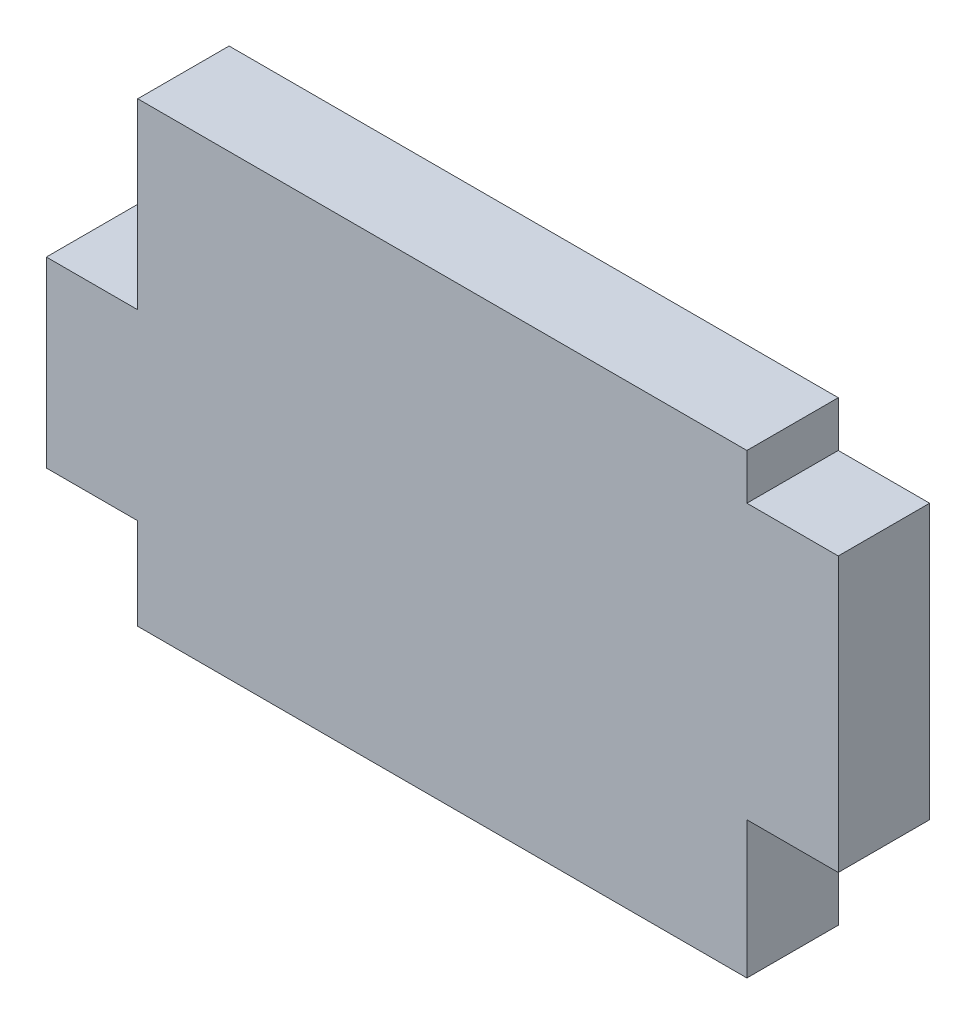
ISO-10303-21;
HEADER;
FILE_DESCRIPTION(('STEP AP214'),'2;1');
FILE_NAME('part.step','',(''),(''),'','','');
FILE_SCHEMA(('AUTOMOTIVE_DESIGN { 1 0 10303 214 1 1 1 1 }'));
ENDSEC;
DATA;
#1=APPLICATION_CONTEXT('core data for automotive mechanical design processes');
#2=APPLICATION_PROTOCOL_DEFINITION('international standard','automotive_design',2000,#1);
#3=PRODUCT_CONTEXT('',#1,'mechanical');
#4=PRODUCT('Part','Part','',(#3));
#5=PRODUCT_RELATED_PRODUCT_CATEGORY('part','',(#4));
#6=PRODUCT_DEFINITION_FORMATION('','',#4);
#7=PRODUCT_DEFINITION_CONTEXT('part definition',#1,'design');
#8=PRODUCT_DEFINITION('design','',#6,#7);
#9=PRODUCT_DEFINITION_SHAPE('','',#8);
#10=(LENGTH_UNIT() NAMED_UNIT(*) SI_UNIT(.MILLI.,.METRE.));
#11=(NAMED_UNIT(*) PLANE_ANGLE_UNIT() SI_UNIT($,.RADIAN.));
#12=(NAMED_UNIT(*) SI_UNIT($,.STERADIAN.) SOLID_ANGLE_UNIT());
#13=UNCERTAINTY_MEASURE_WITH_UNIT(LENGTH_MEASURE(1.E-05),#10,'distance_accuracy_value','');
#14=(GEOMETRIC_REPRESENTATION_CONTEXT(3) GLOBAL_UNCERTAINTY_ASSIGNED_CONTEXT((#13)) GLOBAL_UNIT_ASSIGNED_CONTEXT((#10,
#11,#12)) REPRESENTATION_CONTEXT('',''));
#15=CARTESIAN_POINT('',(0.,0.,0.));
#16=DIRECTION('',(0.,0.,1.));
#17=DIRECTION('',(1.,0.,0.));
#18=AXIS2_PLACEMENT_3D('',#15,#16,#17);
#19=CARTESIAN_POINT('',(0.,0.,6.));
#20=DIRECTION('',(1.,0.,0.));
#21=DIRECTION('',(0.,0.,-1.));
#22=AXIS2_PLACEMENT_3D('',#19,#20,#21);
#23=PLANE('',#22);
#24=DIRECTION('',(0.,-1.,0.));
#25=VECTOR('',#24,1.);
#26=CARTESIAN_POINT('',(0.,0.,6.));
#27=LINE('',#26,#25);
#28=CARTESIAN_POINT('',(0.,17.9999999999958,6.));
#29=VERTEX_POINT('',#28);
#30=CARTESIAN_POINT('',(0.,6.00000000000119,6.));
#31=VERTEX_POINT('',#30);
#32=EDGE_CURVE('E148',#29,#31,#27,.T.);
#33=ORIENTED_EDGE('',*,*,#32,.F.);
#34=DIRECTION('',(0.,0.,1.));
#35=VECTOR('',#34,1.);
#36=CARTESIAN_POINT('',(0.,17.9999999999958,0.));
#37=LINE('',#36,#35);
#38=CARTESIAN_POINT('',(0.,17.9999999999958,0.));
#39=VERTEX_POINT('',#38);
#40=EDGE_CURVE('E196',#39,#29,#37,.T.);
#41=ORIENTED_EDGE('',*,*,#40,.F.);
#42=DIRECTION('',(0.,-1.,0.));
#43=VECTOR('',#42,1.);
#44=CARTESIAN_POINT('',(0.,0.,0.));
#45=LINE('',#44,#43);
#46=CARTESIAN_POINT('',(0.,6.00000000000119,0.));
#47=VERTEX_POINT('',#46);
#48=EDGE_CURVE('E150',#39,#47,#45,.T.);
#49=ORIENTED_EDGE('',*,*,#48,.T.);
#50=DIRECTION('',(0.,0.,1.));
#51=VECTOR('',#50,1.);
#52=CARTESIAN_POINT('',(0.,6.00000000000119,0.));
#53=LINE('',#52,#51);
#54=EDGE_CURVE('E182',#47,#31,#53,.T.);
#55=ORIENTED_EDGE('',*,*,#54,.T.);
#56=EDGE_LOOP('',(#33,#41,#49,#55));
#57=FACE_BOUND('',#56,.T.);
#58=ADVANCED_FACE('F35',(#57),#23,.F.);
#59=CARTESIAN_POINT('',(0.,0.,6.));
#60=DIRECTION('',(0.,1.,0.));
#61=DIRECTION('',(0.,0.,1.));
#62=AXIS2_PLACEMENT_3D('',#59,#60,#61);
#63=PLANE('',#62);
#64=DIRECTION('',(1.,0.,0.));
#65=VECTOR('',#64,1.);
#66=CARTESIAN_POINT('',(0.,0.,0.));
#67=LINE('',#66,#65);
#68=CARTESIAN_POINT('',(6.00000000000119,0.,0.));
#69=VERTEX_POINT('',#68);
#70=CARTESIAN_POINT('',(46.000000000001,0.,0.));
#71=VERTEX_POINT('',#70);
#72=EDGE_CURVE('E146',#69,#71,#67,.T.);
#73=ORIENTED_EDGE('',*,*,#72,.T.);
#74=DIRECTION('',(0.,0.,1.));
#75=VECTOR('',#74,1.);
#76=CARTESIAN_POINT('',(46.000000000001,0.,0.));
#77=LINE('',#76,#75);
#78=CARTESIAN_POINT('',(46.000000000001,0.,6.));
#79=VERTEX_POINT('',#78);
#80=EDGE_CURVE('E174',#71,#79,#77,.T.);
#81=ORIENTED_EDGE('',*,*,#80,.T.);
#82=DIRECTION('',(1.,0.,0.));
#83=VECTOR('',#82,1.);
#84=CARTESIAN_POINT('',(0.,0.,6.));
#85=LINE('',#84,#83);
#86=CARTESIAN_POINT('',(6.00000000000119,0.,6.));
#87=VERTEX_POINT('',#86);
#88=EDGE_CURVE('E157',#87,#79,#85,.T.);
#89=ORIENTED_EDGE('',*,*,#88,.F.);
#90=DIRECTION('',(0.,0.,1.));
#91=VECTOR('',#90,1.);
#92=CARTESIAN_POINT('',(6.00000000000119,0.,0.));
#93=LINE('',#92,#91);
#94=EDGE_CURVE('E177',#69,#87,#93,.T.);
#95=ORIENTED_EDGE('',*,*,#94,.F.);
#96=EDGE_LOOP('',(#73,#81,#89,#95));
#97=FACE_BOUND('',#96,.T.);
#98=ADVANCED_FACE('F220',(#97),#63,.F.);
#99=CARTESIAN_POINT('',(52.,0.,6.));
#100=DIRECTION('',(-1.,0.,0.));
#101=DIRECTION('',(0.,0.,1.));
#102=AXIS2_PLACEMENT_3D('',#99,#100,#101);
#103=PLANE('',#102);
#104=DIRECTION('',(0.,1.,0.));
#105=VECTOR('',#104,1.);
#106=CARTESIAN_POINT('',(52.,0.,6.));
#107=LINE('',#106,#105);
#108=CARTESIAN_POINT('',(52.,8.99999999999925,6.));
#109=VERTEX_POINT('',#108);
#110=CARTESIAN_POINT('',(52.,26.9999999999992,6.));
#111=VERTEX_POINT('',#110);
#112=EDGE_CURVE('E43',#109,#111,#107,.T.);
#113=ORIENTED_EDGE('',*,*,#112,.F.);
#114=DIRECTION('',(0.,0.,1.));
#115=VECTOR('',#114,1.);
#116=CARTESIAN_POINT('',(52.,8.99999999999925,0.));
#117=LINE('',#116,#115);
#118=CARTESIAN_POINT('',(52.,8.99999999999925,0.));
#119=VERTEX_POINT('',#118);
#120=EDGE_CURVE('E128',#119,#109,#117,.T.);
#121=ORIENTED_EDGE('',*,*,#120,.F.);
#122=DIRECTION('',(0.,1.,0.));
#123=VECTOR('',#122,1.);
#124=CARTESIAN_POINT('',(52.,0.,0.));
#125=LINE('',#124,#123);
#126=CARTESIAN_POINT('',(52.,26.9999999999992,0.));
#127=VERTEX_POINT('',#126);
#128=EDGE_CURVE('E139',#119,#127,#125,.T.);
#129=ORIENTED_EDGE('',*,*,#128,.T.);
#130=DIRECTION('',(0.,0.,1.));
#131=VECTOR('',#130,1.);
#132=CARTESIAN_POINT('',(52.,26.9999999999992,0.));
#133=LINE('',#132,#131);
#134=EDGE_CURVE('E154',#127,#111,#133,.T.);
#135=ORIENTED_EDGE('',*,*,#134,.T.);
#136=EDGE_LOOP('',(#113,#121,#129,#135));
#137=FACE_BOUND('',#136,.T.);
#138=ADVANCED_FACE('F137',(#137),#103,.F.);
#139=CARTESIAN_POINT('',(0.,30.,6.));
#140=DIRECTION('',(0.,-1.,0.));
#141=DIRECTION('',(0.,0.,-1.));
#142=AXIS2_PLACEMENT_3D('',#139,#140,#141);
#143=PLANE('',#142);
#144=DIRECTION('',(-1.,0.,0.));
#145=VECTOR('',#144,1.);
#146=CARTESIAN_POINT('',(0.,30.,0.));
#147=LINE('',#146,#145);
#148=CARTESIAN_POINT('',(46.000000000001,30.,0.));
#149=VERTEX_POINT('',#148);
#150=CARTESIAN_POINT('',(6.00000000000111,30.,0.));
#151=VERTEX_POINT('',#150);
#152=EDGE_CURVE('E38',#149,#151,#147,.T.);
#153=ORIENTED_EDGE('',*,*,#152,.T.);
#154=DIRECTION('',(0.,0.,1.));
#155=VECTOR('',#154,1.);
#156=CARTESIAN_POINT('',(6.00000000000111,30.,0.));
#157=LINE('',#156,#155);
#158=CARTESIAN_POINT('',(6.00000000000111,30.,6.));
#159=VERTEX_POINT('',#158);
#160=EDGE_CURVE('E200',#151,#159,#157,.T.);
#161=ORIENTED_EDGE('',*,*,#160,.T.);
#162=DIRECTION('',(-1.,0.,0.));
#163=VECTOR('',#162,1.);
#164=CARTESIAN_POINT('',(0.,30.,6.));
#165=LINE('',#164,#163);
#166=CARTESIAN_POINT('',(46.000000000001,30.,6.));
#167=VERTEX_POINT('',#166);
#168=EDGE_CURVE('E11',#167,#159,#165,.T.);
#169=ORIENTED_EDGE('',*,*,#168,.F.);
#170=DIRECTION('',(0.,0.,1.));
#171=VECTOR('',#170,1.);
#172=CARTESIAN_POINT('',(46.000000000001,30.,0.));
#173=LINE('',#172,#171);
#174=EDGE_CURVE('E162',#149,#167,#173,.T.);
#175=ORIENTED_EDGE('',*,*,#174,.F.);
#176=EDGE_LOOP('',(#153,#161,#169,#175));
#177=FACE_BOUND('',#176,.T.);
#178=ADVANCED_FACE('F244',(#177),#143,.F.);
#179=CARTESIAN_POINT('',(0.,0.,6.));
#180=DIRECTION('',(0.,0.,-1.));
#181=DIRECTION('',(-1.,0.,0.));
#182=AXIS2_PLACEMENT_3D('',#179,#180,#181);
#183=PLANE('',#182);
#184=ORIENTED_EDGE('',*,*,#88,.T.);
#185=DIRECTION('',(0.,-1.,0.));
#186=VECTOR('',#185,1.);
#187=CARTESIAN_POINT('',(46.000000000001,0.,6.));
#188=LINE('',#187,#186);
#189=CARTESIAN_POINT('',(46.000000000001,8.99999999999925,6.));
#190=VERTEX_POINT('',#189);
#191=EDGE_CURVE('E133',#190,#79,#188,.T.);
#192=ORIENTED_EDGE('',*,*,#191,.F.);
#193=DIRECTION('',(-1.,0.,0.));
#194=VECTOR('',#193,1.);
#195=CARTESIAN_POINT('',(52.,8.99999999999925,6.));
#196=LINE('',#195,#194);
#197=EDGE_CURVE('E203',#109,#190,#196,.T.);
#198=ORIENTED_EDGE('',*,*,#197,.F.);
#199=ORIENTED_EDGE('',*,*,#112,.T.);
#200=DIRECTION('',(1.,0.,0.));
#201=VECTOR('',#200,1.);
#202=CARTESIAN_POINT('',(52.,26.9999999999992,6.));
#203=LINE('',#202,#201);
#204=CARTESIAN_POINT('',(46.000000000001,26.9999999999992,6.));
#205=VERTEX_POINT('',#204);
#206=EDGE_CURVE('E167',#205,#111,#203,.T.);
#207=ORIENTED_EDGE('',*,*,#206,.F.);
#208=DIRECTION('',(0.,-1.,0.));
#209=VECTOR('',#208,1.);
#210=CARTESIAN_POINT('',(46.000000000001,30.,6.));
#211=LINE('',#210,#209);
#212=EDGE_CURVE('E171',#167,#205,#211,.T.);
#213=ORIENTED_EDGE('',*,*,#212,.F.);
#214=ORIENTED_EDGE('',*,*,#168,.T.);
#215=DIRECTION('',(0.,1.,0.));
#216=VECTOR('',#215,1.);
#217=CARTESIAN_POINT('',(6.00000000000111,30.,6.));
#218=LINE('',#217,#216);
#219=CARTESIAN_POINT('',(6.00000000000111,17.9999999999958,6.));
#220=VERTEX_POINT('',#219);
#221=EDGE_CURVE('E204',#220,#159,#218,.T.);
#222=ORIENTED_EDGE('',*,*,#221,.F.);
#223=DIRECTION('',(1.,0.,0.));
#224=VECTOR('',#223,1.);
#225=CARTESIAN_POINT('',(0.,17.9999999999958,6.));
#226=LINE('',#225,#224);
#227=EDGE_CURVE('E185',#29,#220,#226,.T.);
#228=ORIENTED_EDGE('',*,*,#227,.F.);
#229=ORIENTED_EDGE('',*,*,#32,.T.);
#230=DIRECTION('',(-1.,8.96418356210837E-13,0.));
#231=VECTOR('',#230,1.);
#232=CARTESIAN_POINT('',(0.,6.00000000000119,6.));
#233=LINE('',#232,#231);
#234=CARTESIAN_POINT('',(6.00000000000119,5.99999999999581,6.));
#235=VERTEX_POINT('',#234);
#236=EDGE_CURVE('E186',#235,#31,#233,.T.);
#237=ORIENTED_EDGE('',*,*,#236,.F.);
#238=DIRECTION('',(0.,1.,0.));
#239=VECTOR('',#238,1.);
#240=CARTESIAN_POINT('',(6.00000000000119,0.,6.));
#241=LINE('',#240,#239);
#242=EDGE_CURVE('E189',#87,#235,#241,.T.);
#243=ORIENTED_EDGE('',*,*,#242,.F.);
#244=EDGE_LOOP('',(#184,#192,#198,#199,#207,#213,#214,#222,#228,#229,#237,#243));
#245=FACE_BOUND('',#244,.T.);
#246=ADVANCED_FACE('F228',(#245),#183,.F.);
#247=CARTESIAN_POINT('',(0.,0.,0.));
#248=DIRECTION('',(0.,0.,-1.));
#249=DIRECTION('',(-1.,0.,0.));
#250=AXIS2_PLACEMENT_3D('',#247,#248,#249);
#251=PLANE('',#250);
#252=DIRECTION('',(0.,-1.,0.));
#253=VECTOR('',#252,1.);
#254=CARTESIAN_POINT('',(46.000000000001,0.,0.));
#255=LINE('',#254,#253);
#256=CARTESIAN_POINT('',(46.000000000001,8.99999999999925,0.));
#257=VERTEX_POINT('',#256);
#258=EDGE_CURVE('E51',#257,#71,#255,.T.);
#259=ORIENTED_EDGE('',*,*,#258,.T.);
#260=ORIENTED_EDGE('',*,*,#72,.F.);
#261=DIRECTION('',(0.,1.,0.));
#262=VECTOR('',#261,1.);
#263=CARTESIAN_POINT('',(6.00000000000119,0.,0.));
#264=LINE('',#263,#262);
#265=CARTESIAN_POINT('',(6.00000000000119,5.99999999999581,0.));
#266=VERTEX_POINT('',#265);
#267=EDGE_CURVE('E188',#69,#266,#264,.T.);
#268=ORIENTED_EDGE('',*,*,#267,.T.);
#269=DIRECTION('',(-1.,8.96418356210837E-13,0.));
#270=VECTOR('',#269,1.);
#271=CARTESIAN_POINT('',(0.,6.00000000000119,0.));
#272=LINE('',#271,#270);
#273=EDGE_CURVE('E180',#266,#47,#272,.T.);
#274=ORIENTED_EDGE('',*,*,#273,.T.);
#275=ORIENTED_EDGE('',*,*,#48,.F.);
#276=DIRECTION('',(1.,0.,0.));
#277=VECTOR('',#276,1.);
#278=CARTESIAN_POINT('',(0.,17.9999999999958,0.));
#279=LINE('',#278,#277);
#280=CARTESIAN_POINT('',(6.00000000000111,17.9999999999958,0.));
#281=VERTEX_POINT('',#280);
#282=EDGE_CURVE('E206',#39,#281,#279,.T.);
#283=ORIENTED_EDGE('',*,*,#282,.T.);
#284=DIRECTION('',(0.,1.,0.));
#285=VECTOR('',#284,1.);
#286=CARTESIAN_POINT('',(6.00000000000111,30.,0.));
#287=LINE('',#286,#285);
#288=EDGE_CURVE('E59',#281,#151,#287,.T.);
#289=ORIENTED_EDGE('',*,*,#288,.T.);
#290=ORIENTED_EDGE('',*,*,#152,.F.);
#291=DIRECTION('',(0.,-1.,0.));
#292=VECTOR('',#291,1.);
#293=CARTESIAN_POINT('',(46.000000000001,30.,0.));
#294=LINE('',#293,#292);
#295=CARTESIAN_POINT('',(46.000000000001,26.9999999999992,0.));
#296=VERTEX_POINT('',#295);
#297=EDGE_CURVE('E170',#149,#296,#294,.T.);
#298=ORIENTED_EDGE('',*,*,#297,.T.);
#299=DIRECTION('',(1.,0.,0.));
#300=VECTOR('',#299,1.);
#301=CARTESIAN_POINT('',(52.,26.9999999999992,0.));
#302=LINE('',#301,#300);
#303=EDGE_CURVE('E145',#296,#127,#302,.T.);
#304=ORIENTED_EDGE('',*,*,#303,.T.);
#305=ORIENTED_EDGE('',*,*,#128,.F.);
#306=DIRECTION('',(-1.,0.,0.));
#307=VECTOR('',#306,1.);
#308=CARTESIAN_POINT('',(52.,8.99999999999925,0.));
#309=LINE('',#308,#307);
#310=EDGE_CURVE('E124',#119,#257,#309,.T.);
#311=ORIENTED_EDGE('',*,*,#310,.T.);
#312=EDGE_LOOP('',(#259,#260,#268,#274,#275,#283,#289,#290,#298,#304,#305,#311));
#313=FACE_BOUND('',#312,.T.);
#314=ADVANCED_FACE('F143',(#313),#251,.T.);
#315=CARTESIAN_POINT('',(52.,26.9999999999992,0.));
#316=DIRECTION('',(0.,-1.,0.));
#317=DIRECTION('',(0.,0.,-1.));
#318=AXIS2_PLACEMENT_3D('',#315,#316,#317);
#319=PLANE('',#318);
#320=ORIENTED_EDGE('',*,*,#206,.T.);
#321=ORIENTED_EDGE('',*,*,#134,.F.);
#322=ORIENTED_EDGE('',*,*,#303,.F.);
#323=DIRECTION('',(0.,0.,1.));
#324=VECTOR('',#323,1.);
#325=CARTESIAN_POINT('',(46.000000000001,26.9999999999992,0.));
#326=LINE('',#325,#324);
#327=EDGE_CURVE('E164',#296,#205,#326,.T.);
#328=ORIENTED_EDGE('',*,*,#327,.T.);
#329=EDGE_LOOP('',(#320,#321,#322,#328));
#330=FACE_BOUND('',#329,.T.);
#331=ADVANCED_FACE('F252',(#330),#319,.F.);
#332=CARTESIAN_POINT('',(46.000000000001,30.,0.));
#333=DIRECTION('',(-1.,0.,0.));
#334=DIRECTION('',(0.,-1.,0.));
#335=AXIS2_PLACEMENT_3D('',#332,#333,#334);
#336=PLANE('',#335);
#337=ORIENTED_EDGE('',*,*,#212,.T.);
#338=ORIENTED_EDGE('',*,*,#327,.F.);
#339=ORIENTED_EDGE('',*,*,#297,.F.);
#340=ORIENTED_EDGE('',*,*,#174,.T.);
#341=EDGE_LOOP('',(#337,#338,#339,#340));
#342=FACE_BOUND('',#341,.T.);
#343=ADVANCED_FACE('F250',(#342),#336,.F.);
#344=CARTESIAN_POINT('',(0.,6.00000000000119,0.));
#345=DIRECTION('',(8.96418356210837E-13,1.,0.));
#346=DIRECTION('',(-1.,8.96418356210837E-13,0.));
#347=AXIS2_PLACEMENT_3D('',#344,#345,#346);
#348=PLANE('',#347);
#349=ORIENTED_EDGE('',*,*,#236,.T.);
#350=ORIENTED_EDGE('',*,*,#54,.F.);
#351=ORIENTED_EDGE('',*,*,#273,.F.);
#352=DIRECTION('',(0.,0.,1.));
#353=VECTOR('',#352,1.);
#354=CARTESIAN_POINT('',(6.00000000000119,5.99999999999581,0.));
#355=LINE('',#354,#353);
#356=EDGE_CURVE('E179',#266,#235,#355,.T.);
#357=ORIENTED_EDGE('',*,*,#356,.T.);
#358=EDGE_LOOP('',(#349,#350,#351,#357));
#359=FACE_BOUND('',#358,.T.);
#360=ADVANCED_FACE('F233',(#359),#348,.F.);
#361=CARTESIAN_POINT('',(6.00000000000119,0.,0.));
#362=DIRECTION('',(1.,0.,0.));
#363=DIRECTION('',(0.,0.,-1.));
#364=AXIS2_PLACEMENT_3D('',#361,#362,#363);
#365=PLANE('',#364);
#366=ORIENTED_EDGE('',*,*,#242,.T.);
#367=ORIENTED_EDGE('',*,*,#356,.F.);
#368=ORIENTED_EDGE('',*,*,#267,.F.);
#369=ORIENTED_EDGE('',*,*,#94,.T.);
#370=EDGE_LOOP('',(#366,#367,#368,#369));
#371=FACE_BOUND('',#370,.T.);
#372=ADVANCED_FACE('F224',(#371),#365,.F.);
#373=CARTESIAN_POINT('',(6.00000000000111,30.,0.));
#374=DIRECTION('',(1.,0.,0.));
#375=DIRECTION('',(0.,1.,0.));
#376=AXIS2_PLACEMENT_3D('',#373,#374,#375);
#377=PLANE('',#376);
#378=ORIENTED_EDGE('',*,*,#221,.T.);
#379=ORIENTED_EDGE('',*,*,#160,.F.);
#380=ORIENTED_EDGE('',*,*,#288,.F.);
#381=DIRECTION('',(0.,0.,1.));
#382=VECTOR('',#381,1.);
#383=CARTESIAN_POINT('',(6.00000000000111,17.9999999999958,0.));
#384=LINE('',#383,#382);
#385=EDGE_CURVE('E198',#281,#220,#384,.T.);
#386=ORIENTED_EDGE('',*,*,#385,.T.);
#387=EDGE_LOOP('',(#378,#379,#380,#386));
#388=FACE_BOUND('',#387,.T.);
#389=ADVANCED_FACE('F241',(#388),#377,.F.);
#390=CARTESIAN_POINT('',(0.,17.9999999999958,0.));
#391=DIRECTION('',(0.,-1.,0.));
#392=DIRECTION('',(1.,0.,0.));
#393=AXIS2_PLACEMENT_3D('',#390,#391,#392);
#394=PLANE('',#393);
#395=ORIENTED_EDGE('',*,*,#227,.T.);
#396=ORIENTED_EDGE('',*,*,#385,.F.);
#397=ORIENTED_EDGE('',*,*,#282,.F.);
#398=ORIENTED_EDGE('',*,*,#40,.T.);
#399=EDGE_LOOP('',(#395,#396,#397,#398));
#400=FACE_BOUND('',#399,.T.);
#401=ADVANCED_FACE('F239',(#400),#394,.F.);
#402=CARTESIAN_POINT('',(46.000000000001,0.,0.));
#403=DIRECTION('',(-1.,0.,0.));
#404=DIRECTION('',(0.,0.,1.));
#405=AXIS2_PLACEMENT_3D('',#402,#403,#404);
#406=PLANE('',#405);
#407=ORIENTED_EDGE('',*,*,#191,.T.);
#408=ORIENTED_EDGE('',*,*,#80,.F.);
#409=ORIENTED_EDGE('',*,*,#258,.F.);
#410=DIRECTION('',(0.,0.,1.));
#411=VECTOR('',#410,1.);
#412=CARTESIAN_POINT('',(46.000000000001,8.99999999999925,0.));
#413=LINE('',#412,#411);
#414=EDGE_CURVE('E130',#257,#190,#413,.T.);
#415=ORIENTED_EDGE('',*,*,#414,.T.);
#416=EDGE_LOOP('',(#407,#408,#409,#415));
#417=FACE_BOUND('',#416,.T.);
#418=ADVANCED_FACE('F324',(#417),#406,.F.);
#419=CARTESIAN_POINT('',(52.,8.99999999999925,0.));
#420=DIRECTION('',(0.,1.,0.));
#421=DIRECTION('',(0.,0.,1.));
#422=AXIS2_PLACEMENT_3D('',#419,#420,#421);
#423=PLANE('',#422);
#424=ORIENTED_EDGE('',*,*,#197,.T.);
#425=ORIENTED_EDGE('',*,*,#414,.F.);
#426=ORIENTED_EDGE('',*,*,#310,.F.);
#427=ORIENTED_EDGE('',*,*,#120,.T.);
#428=EDGE_LOOP('',(#424,#425,#426,#427));
#429=FACE_BOUND('',#428,.T.);
#430=ADVANCED_FACE('F127',(#429),#423,.F.);
#431=CLOSED_SHELL('',(#58,#98,#138,#178,#246,#314,#331,#343,#360,#372,#389,#401,#418,#430));
#432=MANIFOLD_SOLID_BREP('B2',#431);
#433=ADVANCED_BREP_SHAPE_REPRESENTATION('',(#18,#432),#14);
#434=SHAPE_DEFINITION_REPRESENTATION(#9,#433);
ENDSEC;
END-ISO-10303-21;
